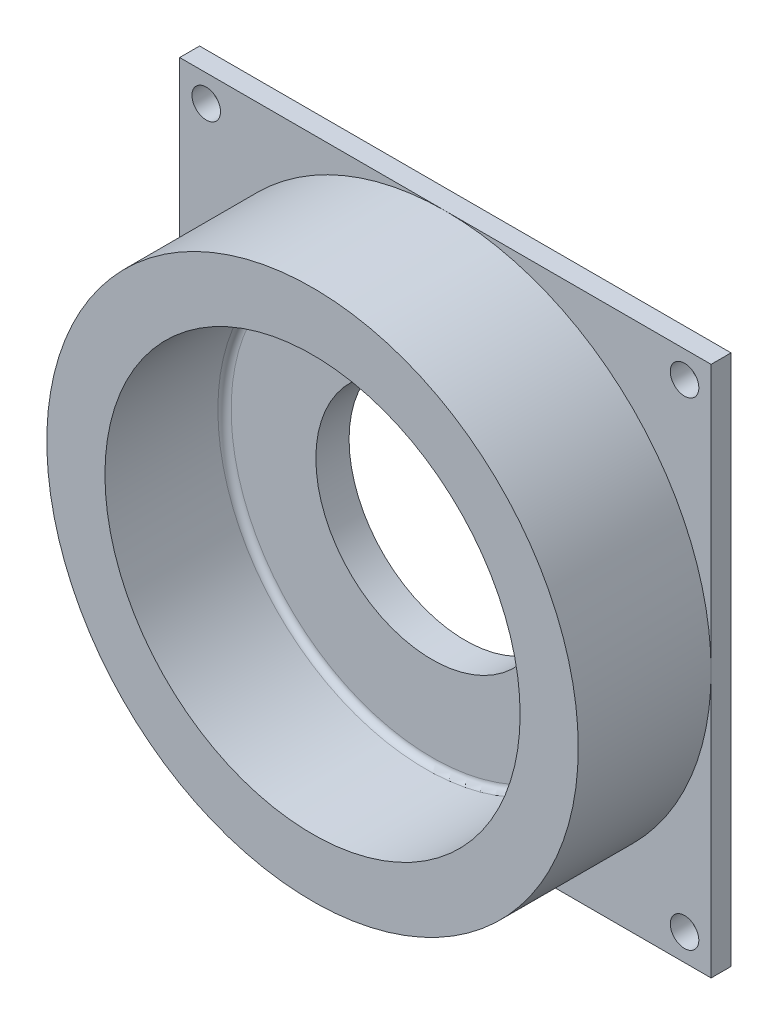
ISO-10303-21;
HEADER;
FILE_DESCRIPTION(('STEP AP214'),'2;1');
FILE_NAME('part.step','',(''),(''),'','','');
FILE_SCHEMA(('AUTOMOTIVE_DESIGN { 1 0 10303 214 1 1 1 1 }'));
ENDSEC;
DATA;
#1=APPLICATION_CONTEXT('core data for automotive mechanical design processes');
#2=APPLICATION_PROTOCOL_DEFINITION('international standard','automotive_design',2000,#1);
#3=PRODUCT_CONTEXT('',#1,'mechanical');
#4=PRODUCT('Part','Part','',(#3));
#5=PRODUCT_RELATED_PRODUCT_CATEGORY('part','',(#4));
#6=PRODUCT_DEFINITION_FORMATION('','',#4);
#7=PRODUCT_DEFINITION_CONTEXT('part definition',#1,'design');
#8=PRODUCT_DEFINITION('design','',#6,#7);
#9=PRODUCT_DEFINITION_SHAPE('','',#8);
#10=(LENGTH_UNIT() NAMED_UNIT(*) SI_UNIT(.MILLI.,.METRE.));
#11=(NAMED_UNIT(*) PLANE_ANGLE_UNIT() SI_UNIT($,.RADIAN.));
#12=(NAMED_UNIT(*) SI_UNIT($,.STERADIAN.) SOLID_ANGLE_UNIT());
#13=UNCERTAINTY_MEASURE_WITH_UNIT(LENGTH_MEASURE(1.E-05),#10,'distance_accuracy_value','');
#14=(GEOMETRIC_REPRESENTATION_CONTEXT(3) GLOBAL_UNCERTAINTY_ASSIGNED_CONTEXT((#13)) GLOBAL_UNIT_ASSIGNED_CONTEXT((#10,
#11,#12)) REPRESENTATION_CONTEXT('',''));
#15=CARTESIAN_POINT('',(0.,0.,0.));
#16=DIRECTION('',(0.,0.,1.));
#17=DIRECTION('',(1.,0.,0.));
#18=AXIS2_PLACEMENT_3D('',#15,#16,#17);
#19=CARTESIAN_POINT('',(0.,0.,20.));
#20=DIRECTION('',(0.,0.,-1.));
#21=DIRECTION('',(-1.,0.,0.));
#22=AXIS2_PLACEMENT_3D('',#19,#20,#21);
#23=CYLINDRICAL_SURFACE('',#22,40.);
#24=CARTESIAN_POINT('',(0.,0.,20.));
#25=DIRECTION('',(0.,0.,1.));
#26=DIRECTION('',(1.,0.,0.));
#27=AXIS2_PLACEMENT_3D('',#24,#25,#26);
#28=CIRCLE('',#27,40.);
#29=CARTESIAN_POINT('',(40.,0.,20.));
#30=VERTEX_POINT('',#29);
#31=EDGE_CURVE('E142',#30,#30,#28,.T.);
#32=ORIENTED_EDGE('',*,*,#31,.F.);
#33=EDGE_LOOP('',(#32));
#34=FACE_BOUND('',#33,.T.);
#35=CARTESIAN_POINT('',(0.,0.,0.));
#36=DIRECTION('',(0.,0.,1.));
#37=DIRECTION('',(1.,0.,0.));
#38=AXIS2_PLACEMENT_3D('',#35,#36,#37);
#39=CIRCLE('',#38,40.);
#40=CARTESIAN_POINT('',(40.,0.,0.));
#41=VERTEX_POINT('',#40);
#42=CARTESIAN_POINT('',(0.,40.,0.));
#43=VERTEX_POINT('',#42);
#44=EDGE_CURVE('E145',#41,#43,#39,.T.);
#45=ORIENTED_EDGE('',*,*,#44,.T.);
#46=CARTESIAN_POINT('',(-40.,0.,0.));
#47=VERTEX_POINT('',#46);
#48=EDGE_CURVE('E55',#43,#47,#39,.T.);
#49=ORIENTED_EDGE('',*,*,#48,.T.);
#50=CARTESIAN_POINT('',(0.,-40.,0.));
#51=VERTEX_POINT('',#50);
#52=EDGE_CURVE('E254',#47,#51,#39,.T.);
#53=ORIENTED_EDGE('',*,*,#52,.T.);
#54=EDGE_CURVE('E141',#51,#41,#39,.T.);
#55=ORIENTED_EDGE('',*,*,#54,.T.);
#56=EDGE_LOOP('',(#45,#49,#53,#55));
#57=FACE_BOUND('',#56,.T.);
#58=ADVANCED_FACE('F32',(#34,#57),#23,.T.);
#59=CARTESIAN_POINT('',(0.,0.,20.));
#60=DIRECTION('',(0.,0.,1.));
#61=DIRECTION('',(1.,0.,0.));
#62=AXIS2_PLACEMENT_3D('',#59,#60,#61);
#63=PLANE('',#62);
#64=CARTESIAN_POINT('',(0.,0.,20.));
#65=DIRECTION('',(0.,0.,1.));
#66=DIRECTION('',(1.,0.,0.));
#67=AXIS2_PLACEMENT_3D('',#64,#65,#66);
#68=CIRCLE('',#67,31.25);
#69=CARTESIAN_POINT('',(31.25,0.,20.));
#70=VERTEX_POINT('',#69);
#71=EDGE_CURVE('E134',#70,#70,#68,.T.);
#72=ORIENTED_EDGE('',*,*,#71,.F.);
#73=EDGE_LOOP('',(#72));
#74=FACE_BOUND('',#73,.T.);
#75=ORIENTED_EDGE('',*,*,#31,.T.);
#76=EDGE_LOOP('',(#75));
#77=FACE_BOUND('',#76,.T.);
#78=ADVANCED_FACE('F168',(#74,#77),#63,.T.);
#79=CARTESIAN_POINT('',(0.,0.,2.));
#80=DIRECTION('',(0.,0.,1.));
#81=DIRECTION('',(1.,0.,0.));
#82=AXIS2_PLACEMENT_3D('',#79,#80,#81);
#83=CYLINDRICAL_SURFACE('',#82,31.25);
#84=CARTESIAN_POINT('',(0.,0.,3.));
#85=DIRECTION('',(0.,0.,1.));
#86=DIRECTION('',(1.,0.,0.));
#87=AXIS2_PLACEMENT_3D('',#84,#85,#86);
#88=CIRCLE('',#87,31.25);
#89=CARTESIAN_POINT('',(31.25,0.,3.));
#90=VERTEX_POINT('',#89);
#91=EDGE_CURVE('E11',#90,#90,#88,.F.);
#92=ORIENTED_EDGE('',*,*,#91,.T.);
#93=EDGE_LOOP('',(#92));
#94=FACE_BOUND('',#93,.T.);
#95=ORIENTED_EDGE('',*,*,#71,.T.);
#96=EDGE_LOOP('',(#95));
#97=FACE_BOUND('',#96,.T.);
#98=ADVANCED_FACE('F163',(#94,#97),#83,.F.);
#99=CARTESIAN_POINT('',(0.,0.,2.));
#100=DIRECTION('',(0.,0.,1.));
#101=DIRECTION('',(1.,0.,0.));
#102=AXIS2_PLACEMENT_3D('',#99,#100,#101);
#103=PLANE('',#102);
#104=CARTESIAN_POINT('',(0.,0.,2.));
#105=DIRECTION('',(0.,0.,1.));
#106=DIRECTION('',(1.,0.,0.));
#107=AXIS2_PLACEMENT_3D('',#104,#105,#106);
#108=CIRCLE('',#107,17.5);
#109=CARTESIAN_POINT('',(17.5,0.,2.));
#110=VERTEX_POINT('',#109);
#111=EDGE_CURVE('E121',#110,#110,#108,.T.);
#112=ORIENTED_EDGE('',*,*,#111,.F.);
#113=EDGE_LOOP('',(#112));
#114=FACE_BOUND('',#113,.T.);
#115=CARTESIAN_POINT('',(0.,0.,2.));
#116=DIRECTION('',(0.,0.,1.));
#117=DIRECTION('',(1.,0.,0.));
#118=AXIS2_PLACEMENT_3D('',#115,#116,#117);
#119=CIRCLE('',#118,30.25);
#120=CARTESIAN_POINT('',(30.25,0.,2.));
#121=VERTEX_POINT('',#120);
#122=EDGE_CURVE('E40',#121,#121,#119,.T.);
#123=ORIENTED_EDGE('',*,*,#122,.T.);
#124=EDGE_LOOP('',(#123));
#125=FACE_BOUND('',#124,.T.);
#126=ADVANCED_FACE('F150',(#114,#125),#103,.T.);
#127=CARTESIAN_POINT('',(0.,0.,3.));
#128=DIRECTION('',(0.,0.,1.));
#129=DIRECTION('',(1.,0.,0.));
#130=AXIS2_PLACEMENT_3D('',#127,#128,#129);
#131=TOROIDAL_SURFACE('',#130,30.25,1.);
#132=ORIENTED_EDGE('',*,*,#91,.F.);
#133=EDGE_LOOP('',(#132));
#134=FACE_BOUND('',#133,.T.);
#135=ORIENTED_EDGE('',*,*,#122,.F.);
#136=EDGE_LOOP('',(#135));
#137=FACE_BOUND('',#136,.T.);
#138=ADVANCED_FACE('F34',(#134,#137),#131,.F.);
#139=CARTESIAN_POINT('',(0.,0.,0.));
#140=DIRECTION('',(0.,0.,1.));
#141=DIRECTION('',(1.,0.,0.));
#142=AXIS2_PLACEMENT_3D('',#139,#140,#141);
#143=PLANE('',#142);
#144=CARTESIAN_POINT('',(36.,36.,0.));
#145=DIRECTION('',(0.,0.,1.));
#146=DIRECTION('',(1.,0.,0.));
#147=AXIS2_PLACEMENT_3D('',#144,#145,#146);
#148=CIRCLE('',#147,2.14999999999999);
#149=CARTESIAN_POINT('',(38.15,36.,0.));
#150=VERTEX_POINT('',#149);
#151=EDGE_CURVE('E234',#150,#150,#148,.T.);
#152=ORIENTED_EDGE('',*,*,#151,.F.);
#153=EDGE_LOOP('',(#152));
#154=FACE_BOUND('',#153,.T.);
#155=ORIENTED_EDGE('',*,*,#44,.F.);
#156=DIRECTION('',(0.,1.,0.));
#157=VECTOR('',#156,1.);
#158=CARTESIAN_POINT('',(40.,-40.,0.));
#159=LINE('',#158,#157);
#160=CARTESIAN_POINT('',(40.,40.,0.));
#161=VERTEX_POINT('',#160);
#162=EDGE_CURVE('E131',#41,#161,#159,.T.);
#163=ORIENTED_EDGE('',*,*,#162,.T.);
#164=DIRECTION('',(-1.,0.,0.));
#165=VECTOR('',#164,1.);
#166=CARTESIAN_POINT('',(40.,40.,0.));
#167=LINE('',#166,#165);
#168=EDGE_CURVE('E115',#161,#43,#167,.T.);
#169=ORIENTED_EDGE('',*,*,#168,.T.);
#170=EDGE_LOOP('',(#155,#163,#169));
#171=FACE_BOUND('',#170,.T.);
#172=ADVANCED_FACE('F153',(#154,#171),#143,.T.);
#173=CARTESIAN_POINT('',(-36.,36.,0.));
#174=DIRECTION('',(0.,0.,1.));
#175=DIRECTION('',(1.,0.,0.));
#176=AXIS2_PLACEMENT_3D('',#173,#174,#175);
#177=CIRCLE('',#176,2.14999999999999);
#178=CARTESIAN_POINT('',(-33.85,36.,0.));
#179=VERTEX_POINT('',#178);
#180=EDGE_CURVE('E240',#179,#179,#177,.T.);
#181=ORIENTED_EDGE('',*,*,#180,.F.);
#182=EDGE_LOOP('',(#181));
#183=FACE_BOUND('',#182,.T.);
#184=ORIENTED_EDGE('',*,*,#48,.F.);
#185=CARTESIAN_POINT('',(-40.,40.,0.));
#186=VERTEX_POINT('',#185);
#187=EDGE_CURVE('E118',#43,#186,#167,.T.);
#188=ORIENTED_EDGE('',*,*,#187,.T.);
#189=DIRECTION('',(0.,-1.,0.));
#190=VECTOR('',#189,1.);
#191=CARTESIAN_POINT('',(-40.,-40.,0.));
#192=LINE('',#191,#190);
#193=EDGE_CURVE('E126',#186,#47,#192,.T.);
#194=ORIENTED_EDGE('',*,*,#193,.T.);
#195=EDGE_LOOP('',(#184,#188,#194));
#196=FACE_BOUND('',#195,.T.);
#197=ADVANCED_FACE('F159',(#183,#196),#143,.T.);
#198=CARTESIAN_POINT('',(-36.,-36.,0.));
#199=DIRECTION('',(0.,0.,1.));
#200=DIRECTION('',(1.,0.,0.));
#201=AXIS2_PLACEMENT_3D('',#198,#199,#200);
#202=CIRCLE('',#201,2.14999999999999);
#203=CARTESIAN_POINT('',(-33.85,-36.,0.));
#204=VERTEX_POINT('',#203);
#205=EDGE_CURVE('E223',#204,#204,#202,.T.);
#206=ORIENTED_EDGE('',*,*,#205,.F.);
#207=EDGE_LOOP('',(#206));
#208=FACE_BOUND('',#207,.T.);
#209=ORIENTED_EDGE('',*,*,#52,.F.);
#210=CARTESIAN_POINT('',(-40.,-40.,0.));
#211=VERTEX_POINT('',#210);
#212=EDGE_CURVE('E129',#47,#211,#192,.T.);
#213=ORIENTED_EDGE('',*,*,#212,.T.);
#214=DIRECTION('',(1.,0.,0.));
#215=VECTOR('',#214,1.);
#216=CARTESIAN_POINT('',(40.,-40.,0.));
#217=LINE('',#216,#215);
#218=EDGE_CURVE('E94',#211,#51,#217,.T.);
#219=ORIENTED_EDGE('',*,*,#218,.T.);
#220=EDGE_LOOP('',(#209,#213,#219));
#221=FACE_BOUND('',#220,.T.);
#222=ADVANCED_FACE('F252',(#208,#221),#143,.T.);
#223=CARTESIAN_POINT('',(36.,-36.,0.));
#224=DIRECTION('',(0.,0.,1.));
#225=DIRECTION('',(1.,0.,0.));
#226=AXIS2_PLACEMENT_3D('',#223,#224,#225);
#227=CIRCLE('',#226,2.14999999999999);
#228=CARTESIAN_POINT('',(38.15,-36.,0.));
#229=VERTEX_POINT('',#228);
#230=EDGE_CURVE('E226',#229,#229,#227,.T.);
#231=ORIENTED_EDGE('',*,*,#230,.F.);
#232=EDGE_LOOP('',(#231));
#233=FACE_BOUND('',#232,.T.);
#234=ORIENTED_EDGE('',*,*,#54,.F.);
#235=CARTESIAN_POINT('',(40.,-40.,0.));
#236=VERTEX_POINT('',#235);
#237=EDGE_CURVE('E128',#51,#236,#217,.T.);
#238=ORIENTED_EDGE('',*,*,#237,.T.);
#239=EDGE_CURVE('E47',#236,#41,#159,.T.);
#240=ORIENTED_EDGE('',*,*,#239,.T.);
#241=EDGE_LOOP('',(#234,#238,#240));
#242=FACE_BOUND('',#241,.T.);
#243=ADVANCED_FACE('F162',(#233,#242),#143,.T.);
#244=CARTESIAN_POINT('',(-40.,-40.,-3.));
#245=DIRECTION('',(-1.,0.,0.));
#246=DIRECTION('',(0.,0.,1.));
#247=AXIS2_PLACEMENT_3D('',#244,#245,#246);
#248=PLANE('',#247);
#249=ORIENTED_EDGE('',*,*,#193,.F.);
#250=DIRECTION('',(0.,0.,1.));
#251=VECTOR('',#250,1.);
#252=CARTESIAN_POINT('',(-40.,40.,-3.));
#253=LINE('',#252,#251);
#254=CARTESIAN_POINT('',(-40.,40.,-3.));
#255=VERTEX_POINT('',#254);
#256=EDGE_CURVE('E114',#255,#186,#253,.T.);
#257=ORIENTED_EDGE('',*,*,#256,.F.);
#258=DIRECTION('',(0.,-1.,0.));
#259=VECTOR('',#258,1.);
#260=CARTESIAN_POINT('',(-40.,-40.,-3.));
#261=LINE('',#260,#259);
#262=CARTESIAN_POINT('',(-40.,-40.,-3.));
#263=VERTEX_POINT('',#262);
#264=EDGE_CURVE('E106',#255,#263,#261,.T.);
#265=ORIENTED_EDGE('',*,*,#264,.T.);
#266=DIRECTION('',(0.,0.,1.));
#267=VECTOR('',#266,1.);
#268=CARTESIAN_POINT('',(-40.,-40.,-3.));
#269=LINE('',#268,#267);
#270=EDGE_CURVE('E87',#263,#211,#269,.T.);
#271=ORIENTED_EDGE('',*,*,#270,.T.);
#272=ORIENTED_EDGE('',*,*,#212,.F.);
#273=EDGE_LOOP('',(#249,#257,#265,#271,#272));
#274=FACE_BOUND('',#273,.T.);
#275=ADVANCED_FACE('F112',(#274),#248,.T.);
#276=CARTESIAN_POINT('',(40.,40.,-3.));
#277=DIRECTION('',(0.,1.,0.));
#278=DIRECTION('',(-1.,0.,0.));
#279=AXIS2_PLACEMENT_3D('',#276,#277,#278);
#280=PLANE('',#279);
#281=ORIENTED_EDGE('',*,*,#168,.F.);
#282=DIRECTION('',(0.,0.,1.));
#283=VECTOR('',#282,1.);
#284=CARTESIAN_POINT('',(40.,40.,-3.));
#285=LINE('',#284,#283);
#286=CARTESIAN_POINT('',(40.,40.,-3.));
#287=VERTEX_POINT('',#286);
#288=EDGE_CURVE('E135',#287,#161,#285,.T.);
#289=ORIENTED_EDGE('',*,*,#288,.F.);
#290=DIRECTION('',(-1.,0.,0.));
#291=VECTOR('',#290,1.);
#292=CARTESIAN_POINT('',(40.,40.,-3.));
#293=LINE('',#292,#291);
#294=EDGE_CURVE('E99',#287,#255,#293,.T.);
#295=ORIENTED_EDGE('',*,*,#294,.T.);
#296=ORIENTED_EDGE('',*,*,#256,.T.);
#297=ORIENTED_EDGE('',*,*,#187,.F.);
#298=EDGE_LOOP('',(#281,#289,#295,#296,#297));
#299=FACE_BOUND('',#298,.T.);
#300=ADVANCED_FACE('F183',(#299),#280,.T.);
#301=CARTESIAN_POINT('',(40.,-40.,-3.));
#302=DIRECTION('',(1.,0.,0.));
#303=DIRECTION('',(0.,0.,-1.));
#304=AXIS2_PLACEMENT_3D('',#301,#302,#303);
#305=PLANE('',#304);
#306=ORIENTED_EDGE('',*,*,#239,.F.);
#307=DIRECTION('',(0.,0.,1.));
#308=VECTOR('',#307,1.);
#309=CARTESIAN_POINT('',(40.,-40.,-3.));
#310=LINE('',#309,#308);
#311=CARTESIAN_POINT('',(40.,-40.,-3.));
#312=VERTEX_POINT('',#311);
#313=EDGE_CURVE('E98',#312,#236,#310,.T.);
#314=ORIENTED_EDGE('',*,*,#313,.F.);
#315=DIRECTION('',(0.,1.,0.));
#316=VECTOR('',#315,1.);
#317=CARTESIAN_POINT('',(40.,-40.,-3.));
#318=LINE('',#317,#316);
#319=EDGE_CURVE('E109',#312,#287,#318,.T.);
#320=ORIENTED_EDGE('',*,*,#319,.T.);
#321=ORIENTED_EDGE('',*,*,#288,.T.);
#322=ORIENTED_EDGE('',*,*,#162,.F.);
#323=EDGE_LOOP('',(#306,#314,#320,#321,#322));
#324=FACE_BOUND('',#323,.T.);
#325=ADVANCED_FACE('F186',(#324),#305,.T.);
#326=CARTESIAN_POINT('',(40.,-40.,-3.));
#327=DIRECTION('',(0.,-1.,0.));
#328=DIRECTION('',(1.,0.,0.));
#329=AXIS2_PLACEMENT_3D('',#326,#327,#328);
#330=PLANE('',#329);
#331=ORIENTED_EDGE('',*,*,#218,.F.);
#332=ORIENTED_EDGE('',*,*,#270,.F.);
#333=DIRECTION('',(1.,0.,0.));
#334=VECTOR('',#333,1.);
#335=CARTESIAN_POINT('',(40.,-40.,-3.));
#336=LINE('',#335,#334);
#337=EDGE_CURVE('E91',#263,#312,#336,.T.);
#338=ORIENTED_EDGE('',*,*,#337,.T.);
#339=ORIENTED_EDGE('',*,*,#313,.T.);
#340=ORIENTED_EDGE('',*,*,#237,.F.);
#341=EDGE_LOOP('',(#331,#332,#338,#339,#340));
#342=FACE_BOUND('',#341,.T.);
#343=ADVANCED_FACE('F89',(#342),#330,.T.);
#344=CARTESIAN_POINT('',(0.,0.,-3.));
#345=DIRECTION('',(0.,0.,1.));
#346=DIRECTION('',(1.,0.,0.));
#347=AXIS2_PLACEMENT_3D('',#344,#345,#346);
#348=PLANE('',#347);
#349=CARTESIAN_POINT('',(-36.,-36.,-3.));
#350=DIRECTION('',(0.,0.,1.));
#351=DIRECTION('',(1.,0.,0.));
#352=AXIS2_PLACEMENT_3D('',#349,#350,#351);
#353=CIRCLE('',#352,2.15);
#354=CARTESIAN_POINT('',(-33.85,-36.,-3.));
#355=VERTEX_POINT('',#354);
#356=EDGE_CURVE('E220',#355,#355,#353,.T.);
#357=ORIENTED_EDGE('',*,*,#356,.T.);
#358=EDGE_LOOP('',(#357));
#359=FACE_BOUND('',#358,.T.);
#360=CARTESIAN_POINT('',(36.,-36.,-3.));
#361=DIRECTION('',(0.,0.,1.));
#362=DIRECTION('',(1.,0.,0.));
#363=AXIS2_PLACEMENT_3D('',#360,#361,#362);
#364=CIRCLE('',#363,2.15);
#365=CARTESIAN_POINT('',(38.15,-36.,-3.));
#366=VERTEX_POINT('',#365);
#367=EDGE_CURVE('E231',#366,#366,#364,.T.);
#368=ORIENTED_EDGE('',*,*,#367,.T.);
#369=EDGE_LOOP('',(#368));
#370=FACE_BOUND('',#369,.T.);
#371=CARTESIAN_POINT('',(36.,36.,-3.));
#372=DIRECTION('',(0.,0.,1.));
#373=DIRECTION('',(1.,0.,0.));
#374=AXIS2_PLACEMENT_3D('',#371,#372,#373);
#375=CIRCLE('',#374,2.15);
#376=CARTESIAN_POINT('',(38.15,36.,-3.));
#377=VERTEX_POINT('',#376);
#378=EDGE_CURVE('E237',#377,#377,#375,.T.);
#379=ORIENTED_EDGE('',*,*,#378,.T.);
#380=EDGE_LOOP('',(#379));
#381=FACE_BOUND('',#380,.T.);
#382=CARTESIAN_POINT('',(-36.,36.,-3.));
#383=DIRECTION('',(0.,0.,1.));
#384=DIRECTION('',(1.,0.,0.));
#385=AXIS2_PLACEMENT_3D('',#382,#383,#384);
#386=CIRCLE('',#385,2.15);
#387=CARTESIAN_POINT('',(-33.85,36.,-3.));
#388=VERTEX_POINT('',#387);
#389=EDGE_CURVE('E243',#388,#388,#386,.T.);
#390=ORIENTED_EDGE('',*,*,#389,.T.);
#391=EDGE_LOOP('',(#390));
#392=FACE_BOUND('',#391,.T.);
#393=CARTESIAN_POINT('',(0.,0.,-3.));
#394=DIRECTION('',(0.,0.,1.));
#395=DIRECTION('',(1.,0.,0.));
#396=AXIS2_PLACEMENT_3D('',#393,#394,#395);
#397=CIRCLE('',#396,17.5);
#398=CARTESIAN_POINT('',(17.5,0.,-3.));
#399=VERTEX_POINT('',#398);
#400=EDGE_CURVE('E245',#399,#399,#397,.T.);
#401=ORIENTED_EDGE('',*,*,#400,.T.);
#402=EDGE_LOOP('',(#401));
#403=FACE_BOUND('',#402,.T.);
#404=ORIENTED_EDGE('',*,*,#264,.F.);
#405=ORIENTED_EDGE('',*,*,#294,.F.);
#406=ORIENTED_EDGE('',*,*,#319,.F.);
#407=ORIENTED_EDGE('',*,*,#337,.F.);
#408=EDGE_LOOP('',(#404,#405,#406,#407));
#409=FACE_BOUND('',#408,.T.);
#410=ADVANCED_FACE('F104',(#359,#370,#381,#392,#403,#409),#348,.F.);
#411=CARTESIAN_POINT('',(0.,0.,-3.));
#412=DIRECTION('',(0.,0.,1.));
#413=DIRECTION('',(1.,0.,0.));
#414=AXIS2_PLACEMENT_3D('',#411,#412,#413);
#415=CYLINDRICAL_SURFACE('',#414,17.5);
#416=ORIENTED_EDGE('',*,*,#111,.T.);
#417=EDGE_LOOP('',(#416));
#418=FACE_BOUND('',#417,.T.);
#419=ORIENTED_EDGE('',*,*,#400,.F.);
#420=EDGE_LOOP('',(#419));
#421=FACE_BOUND('',#420,.T.);
#422=ADVANCED_FACE('F195',(#418,#421),#415,.F.);
#423=CARTESIAN_POINT('',(-36.,36.,0.));
#424=DIRECTION('',(0.,0.,1.));
#425=DIRECTION('',(1.,0.,0.));
#426=AXIS2_PLACEMENT_3D('',#423,#424,#425);
#427=CYLINDRICAL_SURFACE('',#426,2.14999999999999);
#428=ORIENTED_EDGE('',*,*,#389,.F.);
#429=EDGE_LOOP('',(#428));
#430=FACE_BOUND('',#429,.T.);
#431=ORIENTED_EDGE('',*,*,#180,.T.);
#432=EDGE_LOOP('',(#431));
#433=FACE_BOUND('',#432,.T.);
#434=ADVANCED_FACE('F199',(#430,#433),#427,.F.);
#435=CARTESIAN_POINT('',(36.,36.,0.));
#436=DIRECTION('',(0.,0.,1.));
#437=DIRECTION('',(1.,0.,0.));
#438=AXIS2_PLACEMENT_3D('',#435,#436,#437);
#439=CYLINDRICAL_SURFACE('',#438,2.14999999999999);
#440=ORIENTED_EDGE('',*,*,#378,.F.);
#441=EDGE_LOOP('',(#440));
#442=FACE_BOUND('',#441,.T.);
#443=ORIENTED_EDGE('',*,*,#151,.T.);
#444=EDGE_LOOP('',(#443));
#445=FACE_BOUND('',#444,.T.);
#446=ADVANCED_FACE('F203',(#442,#445),#439,.F.);
#447=CARTESIAN_POINT('',(36.,-36.,0.));
#448=DIRECTION('',(0.,0.,1.));
#449=DIRECTION('',(1.,0.,0.));
#450=AXIS2_PLACEMENT_3D('',#447,#448,#449);
#451=CYLINDRICAL_SURFACE('',#450,2.14999999999999);
#452=ORIENTED_EDGE('',*,*,#367,.F.);
#453=EDGE_LOOP('',(#452));
#454=FACE_BOUND('',#453,.T.);
#455=ORIENTED_EDGE('',*,*,#230,.T.);
#456=EDGE_LOOP('',(#455));
#457=FACE_BOUND('',#456,.T.);
#458=ADVANCED_FACE('F207',(#454,#457),#451,.F.);
#459=CARTESIAN_POINT('',(-36.,-36.,0.));
#460=DIRECTION('',(0.,0.,1.));
#461=DIRECTION('',(1.,0.,0.));
#462=AXIS2_PLACEMENT_3D('',#459,#460,#461);
#463=CYLINDRICAL_SURFACE('',#462,2.14999999999999);
#464=ORIENTED_EDGE('',*,*,#356,.F.);
#465=EDGE_LOOP('',(#464));
#466=FACE_BOUND('',#465,.T.);
#467=ORIENTED_EDGE('',*,*,#205,.T.);
#468=EDGE_LOOP('',(#467));
#469=FACE_BOUND('',#468,.T.);
#470=ADVANCED_FACE('F211',(#466,#469),#463,.F.);
#471=CLOSED_SHELL('',(#58,#78,#98,#126,#138,#172,#197,#222,#243,#275,#300,#325,#343,#410,#422,
#434,#446,#458,#470));
#472=MANIFOLD_SOLID_BREP('B2',#471);
#473=ADVANCED_BREP_SHAPE_REPRESENTATION('',(#18,#472),#14);
#474=SHAPE_DEFINITION_REPRESENTATION(#9,#473);
ENDSEC;
END-ISO-10303-21;
